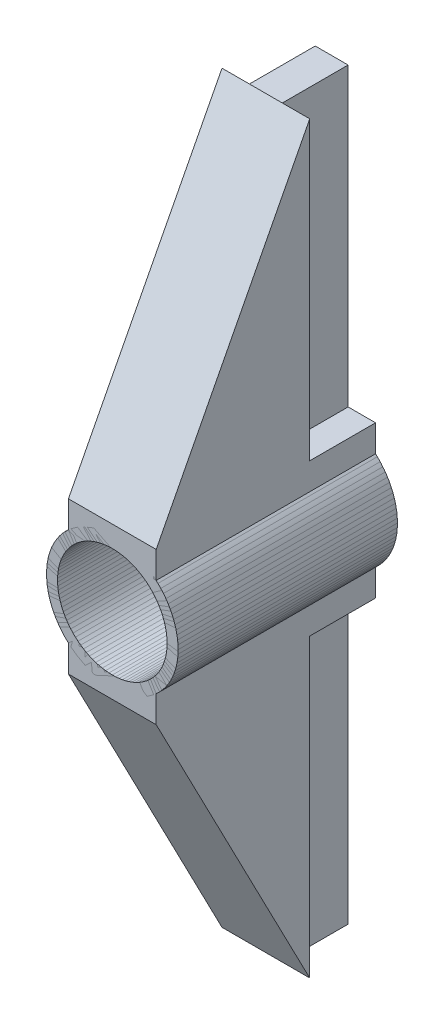
ISO-10303-21;
HEADER;
FILE_DESCRIPTION(('STEP AP214'),'2;1');
FILE_NAME('part.step','',(''),(''),'','','');
FILE_SCHEMA(('AUTOMOTIVE_DESIGN { 1 0 10303 214 1 1 1 1 }'));
ENDSEC;
DATA;
#1=APPLICATION_CONTEXT('core data for automotive mechanical design processes');
#2=APPLICATION_PROTOCOL_DEFINITION('international standard','automotive_design',2000,#1);
#3=PRODUCT_CONTEXT('',#1,'mechanical');
#4=PRODUCT('Part','Part','',(#3));
#5=PRODUCT_RELATED_PRODUCT_CATEGORY('part','',(#4));
#6=PRODUCT_DEFINITION_FORMATION('','',#4);
#7=PRODUCT_DEFINITION_CONTEXT('part definition',#1,'design');
#8=PRODUCT_DEFINITION('design','',#6,#7);
#9=PRODUCT_DEFINITION_SHAPE('','',#8);
#10=(LENGTH_UNIT() NAMED_UNIT(*) SI_UNIT(.MILLI.,.METRE.));
#11=(NAMED_UNIT(*) PLANE_ANGLE_UNIT() SI_UNIT($,.RADIAN.));
#12=(NAMED_UNIT(*) SI_UNIT($,.STERADIAN.) SOLID_ANGLE_UNIT());
#13=UNCERTAINTY_MEASURE_WITH_UNIT(LENGTH_MEASURE(1.E-05),#10,'distance_accuracy_value','');
#14=(GEOMETRIC_REPRESENTATION_CONTEXT(3) GLOBAL_UNCERTAINTY_ASSIGNED_CONTEXT((#13)) GLOBAL_UNIT_ASSIGNED_CONTEXT((#10,
#11,#12)) REPRESENTATION_CONTEXT('',''));
#15=CARTESIAN_POINT('',(0.,0.,0.));
#16=DIRECTION('',(0.,0.,1.));
#17=DIRECTION('',(1.,0.,0.));
#18=AXIS2_PLACEMENT_3D('',#15,#16,#17);
#19=CARTESIAN_POINT('',(0.,0.,20.));
#20=DIRECTION('',(0.,0.,-1.));
#21=DIRECTION('',(1.,0.,0.));
#22=AXIS2_PLACEMENT_3D('',#19,#20,#21);
#23=CYLINDRICAL_SURFACE('',#22,6.);
#24=DIRECTION('',(0.,0.,-1.));
#25=VECTOR('',#24,1.);
#26=CARTESIAN_POINT('',(-3.99999999999997,-4.47213595499961,20.));
#27=LINE('',#26,#25);
#28=CARTESIAN_POINT('',(-3.99999999999997,-4.47213595499961,20.));
#29=VERTEX_POINT('',#28);
#30=CARTESIAN_POINT('',(-3.99999999999997,-4.47213595499961,0.));
#31=VERTEX_POINT('',#30);
#32=EDGE_CURVE('E12',#29,#31,#27,.T.);
#33=ORIENTED_EDGE('',*,*,#32,.F.);
#34=CARTESIAN_POINT('',(0.,0.,20.));
#35=DIRECTION('',(0.,0.,1.));
#36=DIRECTION('',(-1.,0.,0.));
#37=AXIS2_PLACEMENT_3D('',#34,#35,#36);
#38=CIRCLE('',#37,6.);
#39=CARTESIAN_POINT('',(4.00000000000003,-4.47213595499955,20.));
#40=VERTEX_POINT('',#39);
#41=EDGE_CURVE('E235',#40,#29,#38,.T.);
#42=ORIENTED_EDGE('',*,*,#41,.F.);
#43=DIRECTION('',(0.,0.,-1.));
#44=VECTOR('',#43,1.);
#45=CARTESIAN_POINT('',(4.00000000000003,-4.47213595499955,20.));
#46=LINE('',#45,#44);
#47=CARTESIAN_POINT('',(4.00000000000003,-4.47213595499955,0.));
#48=VERTEX_POINT('',#47);
#49=EDGE_CURVE('E63',#40,#48,#46,.T.);
#50=ORIENTED_EDGE('',*,*,#49,.T.);
#51=CARTESIAN_POINT('',(0.,0.,0.));
#52=DIRECTION('',(0.,0.,1.));
#53=DIRECTION('',(-1.,0.,0.));
#54=AXIS2_PLACEMENT_3D('',#51,#52,#53);
#55=CIRCLE('',#54,6.);
#56=EDGE_CURVE('E231',#48,#31,#55,.T.);
#57=ORIENTED_EDGE('',*,*,#56,.T.);
#58=EDGE_LOOP('',(#33,#42,#50,#57));
#59=FACE_BOUND('',#58,.T.);
#60=ADVANCED_FACE('F55',(#59),#23,.T.);
#61=CARTESIAN_POINT('',(0.,0.,20.));
#62=DIRECTION('',(0.,0.,-1.));
#63=DIRECTION('',(1.,0.,0.));
#64=AXIS2_PLACEMENT_3D('',#61,#62,#63);
#65=CYLINDRICAL_SURFACE('',#64,5.);
#66=CARTESIAN_POINT('',(0.,0.,0.));
#67=DIRECTION('',(0.,0.,1.));
#68=DIRECTION('',(-1.,0.,0.));
#69=AXIS2_PLACEMENT_3D('',#66,#67,#68);
#70=CIRCLE('',#69,5.);
#71=CARTESIAN_POINT('',(-5.,0.,0.));
#72=VERTEX_POINT('',#71);
#73=EDGE_CURVE('E226',#72,#72,#70,.T.);
#74=ORIENTED_EDGE('',*,*,#73,.F.);
#75=EDGE_LOOP('',(#74));
#76=FACE_BOUND('',#75,.T.);
#77=CARTESIAN_POINT('',(0.,0.,20.));
#78=DIRECTION('',(0.,0.,1.));
#79=DIRECTION('',(-1.,0.,0.));
#80=AXIS2_PLACEMENT_3D('',#77,#78,#79);
#81=CIRCLE('',#80,5.);
#82=CARTESIAN_POINT('',(-5.,0.,20.));
#83=VERTEX_POINT('',#82);
#84=EDGE_CURVE('E227',#83,#83,#81,.T.);
#85=ORIENTED_EDGE('',*,*,#84,.T.);
#86=EDGE_LOOP('',(#85));
#87=FACE_BOUND('',#86,.T.);
#88=ADVANCED_FACE('F289',(#76,#87),#65,.F.);
#89=CARTESIAN_POINT('',(0.,0.,20.));
#90=DIRECTION('',(0.,0.,1.));
#91=DIRECTION('',(-1.,0.,0.));
#92=AXIS2_PLACEMENT_3D('',#89,#90,#91);
#93=PLANE('',#92);
#94=ORIENTED_EDGE('',*,*,#84,.F.);
#95=EDGE_LOOP('',(#94));
#96=FACE_BOUND('',#95,.T.);
#97=ORIENTED_EDGE('',*,*,#41,.T.);
#98=DIRECTION('',(0.,1.,0.));
#99=VECTOR('',#98,1.);
#100=CARTESIAN_POINT('',(-3.99999999999995,-6.91977190049356,20.));
#101=LINE('',#100,#99);
#102=CARTESIAN_POINT('',(-3.99999999999995,-6.91977190049356,20.));
#103=VERTEX_POINT('',#102);
#104=EDGE_CURVE('E198',#103,#29,#101,.T.);
#105=ORIENTED_EDGE('',*,*,#104,.F.);
#106=DIRECTION('',(1.,0.,0.));
#107=VECTOR('',#106,1.);
#108=CARTESIAN_POINT('',(-3.99999999999995,-6.91977190049356,20.));
#109=LINE('',#108,#107);
#110=CARTESIAN_POINT('',(4.00000000000005,-6.9197719004935,20.));
#111=VERTEX_POINT('',#110);
#112=EDGE_CURVE('E222',#103,#111,#109,.T.);
#113=ORIENTED_EDGE('',*,*,#112,.T.);
#114=DIRECTION('',(0.,1.,0.));
#115=VECTOR('',#114,1.);
#116=CARTESIAN_POINT('',(4.00000000000005,-6.9197719004935,20.));
#117=LINE('',#116,#115);
#118=EDGE_CURVE('E208',#111,#40,#117,.T.);
#119=ORIENTED_EDGE('',*,*,#118,.T.);
#120=EDGE_LOOP('',(#97,#105,#113,#119));
#121=FACE_BOUND('',#120,.T.);
#122=ADVANCED_FACE('F254',(#96,#121),#93,.T.);
#123=CARTESIAN_POINT('',(0.,0.,0.));
#124=DIRECTION('',(0.,0.,1.));
#125=DIRECTION('',(-1.,0.,0.));
#126=AXIS2_PLACEMENT_3D('',#123,#124,#125);
#127=PLANE('',#126);
#128=ORIENTED_EDGE('',*,*,#73,.T.);
#129=EDGE_LOOP('',(#128));
#130=FACE_BOUND('',#129,.T.);
#131=DIRECTION('',(1.,0.,0.));
#132=VECTOR('',#131,1.);
#133=CARTESIAN_POINT('',(4.00000000000005,-6.9197719004935,0.));
#134=LINE('',#133,#132);
#135=CARTESIAN_POINT('',(1.50000000000005,-6.91977190049352,0.));
#136=VERTEX_POINT('',#135);
#137=CARTESIAN_POINT('',(4.00000000000005,-6.9197719004935,0.));
#138=VERTEX_POINT('',#137);
#139=EDGE_CURVE('E149',#136,#138,#134,.T.);
#140=ORIENTED_EDGE('',*,*,#139,.F.);
#141=DIRECTION('',(0.,-1.,0.));
#142=VECTOR('',#141,1.);
#143=CARTESIAN_POINT('',(1.50000000000005,-6.91977190049352,0.));
#144=LINE('',#143,#142);
#145=CARTESIAN_POINT('',(1.50000000000024,-33.9197719004935,0.));
#146=VERTEX_POINT('',#145);
#147=EDGE_CURVE('E161',#136,#146,#144,.T.);
#148=ORIENTED_EDGE('',*,*,#147,.T.);
#149=DIRECTION('',(1.,0.,0.));
#150=VECTOR('',#149,1.);
#151=CARTESIAN_POINT('',(-3.99999999999976,-33.9197719004936,0.));
#152=LINE('',#151,#150);
#153=CARTESIAN_POINT('',(-1.49999999999976,-33.9197719004935,0.));
#154=VERTEX_POINT('',#153);
#155=EDGE_CURVE('E218',#154,#146,#152,.T.);
#156=ORIENTED_EDGE('',*,*,#155,.F.);
#157=DIRECTION('',(0.,-1.,0.));
#158=VECTOR('',#157,1.);
#159=CARTESIAN_POINT('',(-1.49999999999995,-6.91977190049354,0.));
#160=LINE('',#159,#158);
#161=CARTESIAN_POINT('',(-1.49999999999995,-6.91977190049354,0.));
#162=VERTEX_POINT('',#161);
#163=EDGE_CURVE('E70',#162,#154,#160,.T.);
#164=ORIENTED_EDGE('',*,*,#163,.F.);
#165=DIRECTION('',(1.,0.,0.));
#166=VECTOR('',#165,1.);
#167=CARTESIAN_POINT('',(-3.99999999999995,-6.91977190049356,0.));
#168=LINE('',#167,#166);
#169=CARTESIAN_POINT('',(-3.99999999999995,-6.91977190049356,0.));
#170=VERTEX_POINT('',#169);
#171=EDGE_CURVE('E188',#170,#162,#168,.T.);
#172=ORIENTED_EDGE('',*,*,#171,.F.);
#173=DIRECTION('',(0.,-1.,0.));
#174=VECTOR('',#173,1.);
#175=CARTESIAN_POINT('',(-3.99999999999997,-3.91977190049356,0.));
#176=LINE('',#175,#174);
#177=EDGE_CURVE('E201',#31,#170,#176,.T.);
#178=ORIENTED_EDGE('',*,*,#177,.F.);
#179=ORIENTED_EDGE('',*,*,#56,.F.);
#180=DIRECTION('',(0.,-1.,0.));
#181=VECTOR('',#180,1.);
#182=CARTESIAN_POINT('',(4.00000000000003,-3.9197719004935,0.));
#183=LINE('',#182,#181);
#184=EDGE_CURVE('E78',#48,#138,#183,.T.);
#185=ORIENTED_EDGE('',*,*,#184,.T.);
#186=EDGE_LOOP('',(#140,#148,#156,#164,#172,#178,#179,#185));
#187=FACE_BOUND('',#186,.T.);
#188=ADVANCED_FACE('F248',(#130,#187),#127,.F.);
#189=CARTESIAN_POINT('',(-4.,0.,0.));
#190=DIRECTION('',(1.,0.,0.));
#191=DIRECTION('',(0.,0.,1.));
#192=AXIS2_PLACEMENT_3D('',#189,#190,#191);
#193=PLANE('',#192);
#194=DIRECTION('',(0.,0.,-1.));
#195=VECTOR('',#194,1.);
#196=CARTESIAN_POINT('',(-3.99999999999995,-6.91977190049356,6.));
#197=LINE('',#196,#195);
#198=CARTESIAN_POINT('',(-3.99999999999995,-6.91977190049356,6.));
#199=VERTEX_POINT('',#198);
#200=EDGE_CURVE('E180',#199,#170,#197,.T.);
#201=ORIENTED_EDGE('',*,*,#200,.F.);
#202=DIRECTION('',(0.,-1.,0.));
#203=VECTOR('',#202,1.);
#204=CARTESIAN_POINT('',(-3.99999999999995,-6.91977190049356,6.));
#205=LINE('',#204,#203);
#206=CARTESIAN_POINT('',(-3.99999999999976,-33.9197719004936,6.));
#207=VERTEX_POINT('',#206);
#208=EDGE_CURVE('E172',#199,#207,#205,.T.);
#209=ORIENTED_EDGE('',*,*,#208,.T.);
#210=DIRECTION('',(0.,0.887754531448929,0.460317164455));
#211=VECTOR('',#210,1.);
#212=CARTESIAN_POINT('',(-3.99999999999995,-6.91977190049356,20.));
#213=LINE('',#212,#211);
#214=EDGE_CURVE('E194',#207,#103,#213,.T.);
#215=ORIENTED_EDGE('',*,*,#214,.T.);
#216=ORIENTED_EDGE('',*,*,#104,.T.);
#217=ORIENTED_EDGE('',*,*,#32,.T.);
#218=ORIENTED_EDGE('',*,*,#177,.T.);
#219=EDGE_LOOP('',(#201,#209,#215,#216,#217,#218));
#220=FACE_BOUND('',#219,.T.);
#221=ADVANCED_FACE('F252',(#220),#193,.F.);
#222=CARTESIAN_POINT('',(4.,0.,0.));
#223=DIRECTION('',(1.,0.,0.));
#224=DIRECTION('',(0.,0.,1.));
#225=AXIS2_PLACEMENT_3D('',#222,#223,#224);
#226=PLANE('',#225);
#227=DIRECTION('',(0.,-1.,0.));
#228=VECTOR('',#227,1.);
#229=CARTESIAN_POINT('',(4.00000000000005,-6.9197719004935,6.));
#230=LINE('',#229,#228);
#231=CARTESIAN_POINT('',(4.00000000000005,-6.9197719004935,6.));
#232=VERTEX_POINT('',#231);
#233=CARTESIAN_POINT('',(4.00000000000024,-33.9197719004935,6.));
#234=VERTEX_POINT('',#233);
#235=EDGE_CURVE('E137',#232,#234,#230,.T.);
#236=ORIENTED_EDGE('',*,*,#235,.F.);
#237=DIRECTION('',(0.,0.,1.));
#238=VECTOR('',#237,1.);
#239=CARTESIAN_POINT('',(4.00000000000005,-6.9197719004935,6.));
#240=LINE('',#239,#238);
#241=EDGE_CURVE('E145',#138,#232,#240,.T.);
#242=ORIENTED_EDGE('',*,*,#241,.F.);
#243=ORIENTED_EDGE('',*,*,#184,.F.);
#244=ORIENTED_EDGE('',*,*,#49,.F.);
#245=ORIENTED_EDGE('',*,*,#118,.F.);
#246=DIRECTION('',(0.,0.887754531448929,0.460317164455));
#247=VECTOR('',#246,1.);
#248=CARTESIAN_POINT('',(4.00000000000005,-6.9197719004935,20.));
#249=LINE('',#248,#247);
#250=EDGE_CURVE('E156',#234,#111,#249,.T.);
#251=ORIENTED_EDGE('',*,*,#250,.F.);
#252=EDGE_LOOP('',(#236,#242,#243,#244,#245,#251));
#253=FACE_BOUND('',#252,.T.);
#254=ADVANCED_FACE('F154',(#253),#226,.T.);
#255=CARTESIAN_POINT('',(-3.99999999999995,-6.91977190049356,20.));
#256=DIRECTION('',(0.,0.460317164455,-0.887754531448929));
#257=DIRECTION('',(0.,-0.887754531448929,-0.460317164455));
#258=AXIS2_PLACEMENT_3D('',#255,#256,#257);
#259=PLANE('',#258);
#260=ORIENTED_EDGE('',*,*,#250,.T.);
#261=ORIENTED_EDGE('',*,*,#112,.F.);
#262=ORIENTED_EDGE('',*,*,#214,.F.);
#263=DIRECTION('',(1.,0.,0.));
#264=VECTOR('',#263,1.);
#265=CARTESIAN_POINT('',(-3.99999999999976,-33.9197719004936,6.));
#266=LINE('',#265,#264);
#267=CARTESIAN_POINT('',(-1.49999999999976,-33.9197719004935,6.));
#268=VERTEX_POINT('',#267);
#269=EDGE_CURVE('E214',#207,#268,#266,.T.);
#270=ORIENTED_EDGE('',*,*,#269,.T.);
#271=CARTESIAN_POINT('',(1.50000000000024,-33.9197719004935,6.));
#272=VERTEX_POINT('',#271);
#273=EDGE_CURVE('E205',#268,#272,#266,.T.);
#274=ORIENTED_EDGE('',*,*,#273,.T.);
#275=DIRECTION('',(-1.,0.,0.));
#276=VECTOR('',#275,1.);
#277=CARTESIAN_POINT('',(1.50000000000024,-33.9197719004935,6.));
#278=LINE('',#277,#276);
#279=EDGE_CURVE('E179',#234,#272,#278,.T.);
#280=ORIENTED_EDGE('',*,*,#279,.F.);
#281=EDGE_LOOP('',(#260,#261,#262,#270,#274,#280));
#282=FACE_BOUND('',#281,.T.);
#283=ADVANCED_FACE('F258',(#282),#259,.F.);
#284=CARTESIAN_POINT('',(-3.99999999999976,-33.9197719004936,6.));
#285=DIRECTION('',(0.,1.,0.));
#286=DIRECTION('',(0.,0.,-1.));
#287=AXIS2_PLACEMENT_3D('',#284,#285,#286);
#288=PLANE('',#287);
#289=ORIENTED_EDGE('',*,*,#155,.T.);
#290=DIRECTION('',(0.,0.,-1.));
#291=VECTOR('',#290,1.);
#292=CARTESIAN_POINT('',(1.50000000000024,-33.9197719004935,0.));
#293=LINE('',#292,#291);
#294=EDGE_CURVE('E151',#272,#146,#293,.T.);
#295=ORIENTED_EDGE('',*,*,#294,.F.);
#296=ORIENTED_EDGE('',*,*,#273,.F.);
#297=DIRECTION('',(0.,0.,1.));
#298=VECTOR('',#297,1.);
#299=CARTESIAN_POINT('',(-1.49999999999976,-33.9197719004935,0.));
#300=LINE('',#299,#298);
#301=EDGE_CURVE('E176',#154,#268,#300,.T.);
#302=ORIENTED_EDGE('',*,*,#301,.F.);
#303=EDGE_LOOP('',(#289,#295,#296,#302));
#304=FACE_BOUND('',#303,.T.);
#305=ADVANCED_FACE('F272',(#304),#288,.F.);
#306=CARTESIAN_POINT('',(-1.49999999999995,-6.91977190049354,6.));
#307=DIRECTION('',(0.,0.,1.));
#308=DIRECTION('',(-1.,0.,0.));
#309=AXIS2_PLACEMENT_3D('',#306,#307,#308);
#310=PLANE('',#309);
#311=ORIENTED_EDGE('',*,*,#269,.F.);
#312=ORIENTED_EDGE('',*,*,#208,.F.);
#313=DIRECTION('',(-1.,0.,0.));
#314=VECTOR('',#313,1.);
#315=CARTESIAN_POINT('',(-1.49999999999995,-6.91977190049354,6.));
#316=LINE('',#315,#314);
#317=CARTESIAN_POINT('',(-1.49999999999995,-6.91977190049354,6.));
#318=VERTEX_POINT('',#317);
#319=EDGE_CURVE('E168',#318,#199,#316,.T.);
#320=ORIENTED_EDGE('',*,*,#319,.F.);
#321=DIRECTION('',(0.,-1.,0.));
#322=VECTOR('',#321,1.);
#323=CARTESIAN_POINT('',(-1.49999999999995,-6.91977190049354,6.));
#324=LINE('',#323,#322);
#325=EDGE_CURVE('E169',#318,#268,#324,.T.);
#326=ORIENTED_EDGE('',*,*,#325,.T.);
#327=EDGE_LOOP('',(#311,#312,#320,#326));
#328=FACE_BOUND('',#327,.T.);
#329=ADVANCED_FACE('F278',(#328),#310,.F.);
#330=CARTESIAN_POINT('',(-1.49999999999995,-6.91977190049354,0.));
#331=DIRECTION('',(1.,0.,0.));
#332=DIRECTION('',(0.,0.,1.));
#333=AXIS2_PLACEMENT_3D('',#330,#331,#332);
#334=PLANE('',#333);
#335=ORIENTED_EDGE('',*,*,#301,.T.);
#336=ORIENTED_EDGE('',*,*,#325,.F.);
#337=DIRECTION('',(0.,0.,1.));
#338=VECTOR('',#337,1.);
#339=CARTESIAN_POINT('',(-1.49999999999995,-6.91977190049354,0.));
#340=LINE('',#339,#338);
#341=EDGE_CURVE('E184',#162,#318,#340,.T.);
#342=ORIENTED_EDGE('',*,*,#341,.F.);
#343=ORIENTED_EDGE('',*,*,#163,.T.);
#344=EDGE_LOOP('',(#335,#336,#342,#343));
#345=FACE_BOUND('',#344,.T.);
#346=ADVANCED_FACE('F273',(#345),#334,.F.);
#347=CARTESIAN_POINT('',(0.,-6.91977190049353,0.));
#348=DIRECTION('',(0.,-1.,0.));
#349=DIRECTION('',(0.,0.,1.));
#350=AXIS2_PLACEMENT_3D('',#347,#348,#349);
#351=PLANE('',#350);
#352=ORIENTED_EDGE('',*,*,#200,.T.);
#353=ORIENTED_EDGE('',*,*,#171,.T.);
#354=ORIENTED_EDGE('',*,*,#341,.T.);
#355=ORIENTED_EDGE('',*,*,#319,.T.);
#356=EDGE_LOOP('',(#352,#353,#354,#355));
#357=FACE_BOUND('',#356,.T.);
#358=ADVANCED_FACE('F277',(#357),#351,.T.);
#359=CARTESIAN_POINT('',(1.50000000000005,-6.91977190049352,0.));
#360=DIRECTION('',(-1.,0.,0.));
#361=DIRECTION('',(0.,0.,-1.));
#362=AXIS2_PLACEMENT_3D('',#359,#360,#361);
#363=PLANE('',#362);
#364=ORIENTED_EDGE('',*,*,#294,.T.);
#365=ORIENTED_EDGE('',*,*,#147,.F.);
#366=DIRECTION('',(0.,0.,-1.));
#367=VECTOR('',#366,1.);
#368=CARTESIAN_POINT('',(1.50000000000005,-6.91977190049352,0.));
#369=LINE('',#368,#367);
#370=CARTESIAN_POINT('',(1.50000000000005,-6.91977190049352,6.));
#371=VERTEX_POINT('',#370);
#372=EDGE_CURVE('E144',#371,#136,#369,.T.);
#373=ORIENTED_EDGE('',*,*,#372,.F.);
#374=DIRECTION('',(0.,-1.,0.));
#375=VECTOR('',#374,1.);
#376=CARTESIAN_POINT('',(1.50000000000005,-6.91977190049352,6.));
#377=LINE('',#376,#375);
#378=EDGE_CURVE('E139',#371,#272,#377,.T.);
#379=ORIENTED_EDGE('',*,*,#378,.T.);
#380=EDGE_LOOP('',(#364,#365,#373,#379));
#381=FACE_BOUND('',#380,.T.);
#382=ADVANCED_FACE('F315',(#381),#363,.F.);
#383=CARTESIAN_POINT('',(1.50000000000005,-6.91977190049352,6.));
#384=DIRECTION('',(0.,0.,1.));
#385=DIRECTION('',(-1.,0.,0.));
#386=AXIS2_PLACEMENT_3D('',#383,#384,#385);
#387=PLANE('',#386);
#388=ORIENTED_EDGE('',*,*,#279,.T.);
#389=ORIENTED_EDGE('',*,*,#378,.F.);
#390=DIRECTION('',(-1.,0.,0.));
#391=VECTOR('',#390,1.);
#392=CARTESIAN_POINT('',(1.50000000000005,-6.91977190049352,6.));
#393=LINE('',#392,#391);
#394=EDGE_CURVE('E132',#232,#371,#393,.T.);
#395=ORIENTED_EDGE('',*,*,#394,.F.);
#396=ORIENTED_EDGE('',*,*,#235,.T.);
#397=EDGE_LOOP('',(#388,#389,#395,#396));
#398=FACE_BOUND('',#397,.T.);
#399=ADVANCED_FACE('F135',(#398),#387,.F.);
#400=CARTESIAN_POINT('',(0.,-6.91977190049353,0.));
#401=DIRECTION('',(0.,1.,0.));
#402=DIRECTION('',(0.,0.,-1.));
#403=AXIS2_PLACEMENT_3D('',#400,#401,#402);
#404=PLANE('',#403);
#405=ORIENTED_EDGE('',*,*,#241,.T.);
#406=ORIENTED_EDGE('',*,*,#394,.T.);
#407=ORIENTED_EDGE('',*,*,#372,.T.);
#408=ORIENTED_EDGE('',*,*,#139,.T.);
#409=EDGE_LOOP('',(#405,#406,#407,#408));
#410=FACE_BOUND('',#409,.T.);
#411=ADVANCED_FACE('F147',(#410),#404,.F.);
#412=CLOSED_SHELL('',(#60,#88,#122,#188,#221,#254,#283,#305,#329,#346,#358,#382,#399,#411));
#413=MANIFOLD_SOLID_BREP('B2',#412);
#414=CARTESIAN_POINT('',(0.,0.,20.));
#415=DIRECTION('',(0.,0.,-1.));
#416=DIRECTION('',(-1.,0.,0.));
#417=AXIS2_PLACEMENT_3D('',#414,#415,#416);
#418=CYLINDRICAL_SURFACE('',#417,6.);
#419=DIRECTION('',(0.,0.,-1.));
#420=VECTOR('',#419,1.);
#421=CARTESIAN_POINT('',(4.,4.47213595499958,20.));
#422=LINE('',#421,#420);
#423=CARTESIAN_POINT('',(4.,4.47213595499958,20.));
#424=VERTEX_POINT('',#423);
#425=CARTESIAN_POINT('',(4.,4.47213595499958,0.));
#426=VERTEX_POINT('',#425);
#427=EDGE_CURVE('E53',#424,#426,#422,.T.);
#428=ORIENTED_EDGE('',*,*,#427,.F.);
#429=CARTESIAN_POINT('',(0.,0.,20.));
#430=DIRECTION('',(0.,0.,1.));
#431=DIRECTION('',(1.,0.,0.));
#432=AXIS2_PLACEMENT_3D('',#429,#430,#431);
#433=CIRCLE('',#432,6.);
#434=CARTESIAN_POINT('',(-4.,4.47213595499958,20.));
#435=VERTEX_POINT('',#434);
#436=EDGE_CURVE('E566',#435,#424,#433,.T.);
#437=ORIENTED_EDGE('',*,*,#436,.F.);
#438=DIRECTION('',(0.,0.,-1.));
#439=VECTOR('',#438,1.);
#440=CARTESIAN_POINT('',(-4.,4.47213595499958,20.));
#441=LINE('',#440,#439);
#442=CARTESIAN_POINT('',(-4.,4.47213595499958,0.));
#443=VERTEX_POINT('',#442);
#444=EDGE_CURVE('E418',#435,#443,#441,.T.);
#445=ORIENTED_EDGE('',*,*,#444,.T.);
#446=CARTESIAN_POINT('',(0.,0.,0.));
#447=DIRECTION('',(0.,0.,1.));
#448=DIRECTION('',(1.,0.,0.));
#449=AXIS2_PLACEMENT_3D('',#446,#447,#448);
#450=CIRCLE('',#449,6.);
#451=EDGE_CURVE('E563',#443,#426,#450,.T.);
#452=ORIENTED_EDGE('',*,*,#451,.T.);
#453=EDGE_LOOP('',(#428,#437,#445,#452));
#454=FACE_BOUND('',#453,.T.);
#455=ADVANCED_FACE('F411',(#454),#418,.T.);
#456=CARTESIAN_POINT('',(0.,0.,20.));
#457=DIRECTION('',(0.,0.,-1.));
#458=DIRECTION('',(-1.,0.,0.));
#459=AXIS2_PLACEMENT_3D('',#456,#457,#458);
#460=CYLINDRICAL_SURFACE('',#459,5.);
#461=CARTESIAN_POINT('',(0.,0.,0.));
#462=DIRECTION('',(0.,0.,1.));
#463=DIRECTION('',(1.,0.,0.));
#464=AXIS2_PLACEMENT_3D('',#461,#462,#463);
#465=CIRCLE('',#464,5.);
#466=CARTESIAN_POINT('',(5.,0.,0.));
#467=VERTEX_POINT('',#466);
#468=EDGE_CURVE('E559',#467,#467,#465,.T.);
#469=ORIENTED_EDGE('',*,*,#468,.F.);
#470=EDGE_LOOP('',(#469));
#471=FACE_BOUND('',#470,.T.);
#472=CARTESIAN_POINT('',(0.,0.,20.));
#473=DIRECTION('',(0.,0.,1.));
#474=DIRECTION('',(1.,0.,0.));
#475=AXIS2_PLACEMENT_3D('',#472,#473,#474);
#476=CIRCLE('',#475,5.);
#477=CARTESIAN_POINT('',(5.,0.,20.));
#478=VERTEX_POINT('',#477);
#479=EDGE_CURVE('E560',#478,#478,#476,.T.);
#480=ORIENTED_EDGE('',*,*,#479,.T.);
#481=EDGE_LOOP('',(#480));
#482=FACE_BOUND('',#481,.T.);
#483=ADVANCED_FACE('F614',(#471,#482),#460,.F.);
#484=CARTESIAN_POINT('',(0.,0.,20.));
#485=DIRECTION('',(0.,0.,1.));
#486=DIRECTION('',(1.,0.,0.));
#487=AXIS2_PLACEMENT_3D('',#484,#485,#486);
#488=PLANE('',#487);
#489=ORIENTED_EDGE('',*,*,#479,.F.);
#490=EDGE_LOOP('',(#489));
#491=FACE_BOUND('',#490,.T.);
#492=ORIENTED_EDGE('',*,*,#436,.T.);
#493=DIRECTION('',(0.,-1.,0.));
#494=VECTOR('',#493,1.);
#495=CARTESIAN_POINT('',(4.,6.91977190049353,20.));
#496=LINE('',#495,#494);
#497=CARTESIAN_POINT('',(4.,6.91977190049353,20.));
#498=VERTEX_POINT('',#497);
#499=EDGE_CURVE('E539',#498,#424,#496,.T.);
#500=ORIENTED_EDGE('',*,*,#499,.F.);
#501=DIRECTION('',(-1.,0.,0.));
#502=VECTOR('',#501,1.);
#503=CARTESIAN_POINT('',(4.,6.91977190049353,20.));
#504=LINE('',#503,#502);
#505=CARTESIAN_POINT('',(-4.,6.91977190049353,20.));
#506=VERTEX_POINT('',#505);
#507=EDGE_CURVE('E556',#498,#506,#504,.T.);
#508=ORIENTED_EDGE('',*,*,#507,.T.);
#509=DIRECTION('',(0.,-1.,0.));
#510=VECTOR('',#509,1.);
#511=CARTESIAN_POINT('',(-4.,6.91977190049353,20.));
#512=LINE('',#511,#510);
#513=EDGE_CURVE('E546',#506,#435,#512,.T.);
#514=ORIENTED_EDGE('',*,*,#513,.T.);
#515=EDGE_LOOP('',(#492,#500,#508,#514));
#516=FACE_BOUND('',#515,.T.);
#517=ADVANCED_FACE('F582',(#491,#516),#488,.T.);
#518=CARTESIAN_POINT('',(0.,0.,0.));
#519=DIRECTION('',(0.,0.,1.));
#520=DIRECTION('',(1.,0.,0.));
#521=AXIS2_PLACEMENT_3D('',#518,#519,#520);
#522=PLANE('',#521);
#523=ORIENTED_EDGE('',*,*,#468,.T.);
#524=EDGE_LOOP('',(#523));
#525=FACE_BOUND('',#524,.T.);
#526=DIRECTION('',(-1.,0.,0.));
#527=VECTOR('',#526,1.);
#528=CARTESIAN_POINT('',(-4.,6.91977190049353,0.));
#529=LINE('',#528,#527);
#530=CARTESIAN_POINT('',(-1.5,6.91977190049353,0.));
#531=VERTEX_POINT('',#530);
#532=CARTESIAN_POINT('',(-4.,6.91977190049353,0.));
#533=VERTEX_POINT('',#532);
#534=EDGE_CURVE('E503',#531,#533,#529,.T.);
#535=ORIENTED_EDGE('',*,*,#534,.F.);
#536=DIRECTION('',(0.,1.,0.));
#537=VECTOR('',#536,1.);
#538=CARTESIAN_POINT('',(-1.5,6.91977190049353,0.));
#539=LINE('',#538,#537);
#540=CARTESIAN_POINT('',(-1.5,33.9197719004935,0.));
#541=VERTEX_POINT('',#540);
#542=EDGE_CURVE('E511',#531,#541,#539,.T.);
#543=ORIENTED_EDGE('',*,*,#542,.T.);
#544=DIRECTION('',(-1.,0.,0.));
#545=VECTOR('',#544,1.);
#546=CARTESIAN_POINT('',(4.,33.9197719004935,0.));
#547=LINE('',#546,#545);
#548=CARTESIAN_POINT('',(1.5,33.9197719004935,0.));
#549=VERTEX_POINT('',#548);
#550=EDGE_CURVE('E553',#549,#541,#547,.T.);
#551=ORIENTED_EDGE('',*,*,#550,.F.);
#552=DIRECTION('',(0.,1.,0.));
#553=VECTOR('',#552,1.);
#554=CARTESIAN_POINT('',(1.5,6.91977190049353,0.));
#555=LINE('',#554,#553);
#556=CARTESIAN_POINT('',(1.5,6.91977190049353,0.));
#557=VERTEX_POINT('',#556);
#558=EDGE_CURVE('E425',#557,#549,#555,.T.);
#559=ORIENTED_EDGE('',*,*,#558,.F.);
#560=DIRECTION('',(-1.,0.,0.));
#561=VECTOR('',#560,1.);
#562=CARTESIAN_POINT('',(4.,6.91977190049353,0.));
#563=LINE('',#562,#561);
#564=CARTESIAN_POINT('',(4.,6.91977190049353,0.));
#565=VERTEX_POINT('',#564);
#566=EDGE_CURVE('E532',#565,#557,#563,.T.);
#567=ORIENTED_EDGE('',*,*,#566,.F.);
#568=DIRECTION('',(0.,1.,0.));
#569=VECTOR('',#568,1.);
#570=CARTESIAN_POINT('',(4.,3.91977190049353,0.));
#571=LINE('',#570,#569);
#572=EDGE_CURVE('E541',#426,#565,#571,.T.);
#573=ORIENTED_EDGE('',*,*,#572,.F.);
#574=ORIENTED_EDGE('',*,*,#451,.F.);
#575=DIRECTION('',(0.,1.,0.));
#576=VECTOR('',#575,1.);
#577=CARTESIAN_POINT('',(-4.,3.91977190049353,0.));
#578=LINE('',#577,#576);
#579=EDGE_CURVE('E433',#443,#533,#578,.T.);
#580=ORIENTED_EDGE('',*,*,#579,.T.);
#581=EDGE_LOOP('',(#535,#543,#551,#559,#567,#573,#574,#580));
#582=FACE_BOUND('',#581,.T.);
#583=ADVANCED_FACE('F576',(#525,#582),#522,.F.);
#584=CARTESIAN_POINT('',(4.,0.,0.));
#585=DIRECTION('',(-1.,0.,0.));
#586=DIRECTION('',(0.,0.,1.));
#587=AXIS2_PLACEMENT_3D('',#584,#585,#586);
#588=PLANE('',#587);
#589=DIRECTION('',(0.,0.,-1.));
#590=VECTOR('',#589,1.);
#591=CARTESIAN_POINT('',(4.,6.91977190049353,6.));
#592=LINE('',#591,#590);
#593=CARTESIAN_POINT('',(4.,6.91977190049353,6.));
#594=VERTEX_POINT('',#593);
#595=EDGE_CURVE('E526',#594,#565,#592,.T.);
#596=ORIENTED_EDGE('',*,*,#595,.F.);
#597=DIRECTION('',(0.,1.,0.));
#598=VECTOR('',#597,1.);
#599=CARTESIAN_POINT('',(4.,6.91977190049353,6.));
#600=LINE('',#599,#598);
#601=CARTESIAN_POINT('',(4.,33.9197719004935,6.));
#602=VERTEX_POINT('',#601);
#603=EDGE_CURVE('E520',#594,#602,#600,.T.);
#604=ORIENTED_EDGE('',*,*,#603,.T.);
#605=DIRECTION('',(0.,-0.887754531448929,0.460317164455));
#606=VECTOR('',#605,1.);
#607=CARTESIAN_POINT('',(4.,6.91977190049353,20.));
#608=LINE('',#607,#606);
#609=EDGE_CURVE('E536',#602,#498,#608,.T.);
#610=ORIENTED_EDGE('',*,*,#609,.T.);
#611=ORIENTED_EDGE('',*,*,#499,.T.);
#612=ORIENTED_EDGE('',*,*,#427,.T.);
#613=ORIENTED_EDGE('',*,*,#572,.T.);
#614=EDGE_LOOP('',(#596,#604,#610,#611,#612,#613));
#615=FACE_BOUND('',#614,.T.);
#616=ADVANCED_FACE('F580',(#615),#588,.F.);
#617=CARTESIAN_POINT('',(-4.,0.,0.));
#618=DIRECTION('',(-1.,0.,0.));
#619=DIRECTION('',(0.,0.,1.));
#620=AXIS2_PLACEMENT_3D('',#617,#618,#619);
#621=PLANE('',#620);
#622=DIRECTION('',(0.,1.,0.));
#623=VECTOR('',#622,1.);
#624=CARTESIAN_POINT('',(-4.,6.91977190049353,6.));
#625=LINE('',#624,#623);
#626=CARTESIAN_POINT('',(-4.,6.91977190049353,6.));
#627=VERTEX_POINT('',#626);
#628=CARTESIAN_POINT('',(-4.,33.9197719004935,6.));
#629=VERTEX_POINT('',#628);
#630=EDGE_CURVE('E492',#627,#629,#625,.T.);
#631=ORIENTED_EDGE('',*,*,#630,.F.);
#632=DIRECTION('',(0.,0.,1.));
#633=VECTOR('',#632,1.);
#634=CARTESIAN_POINT('',(-4.,6.91977190049353,6.));
#635=LINE('',#634,#633);
#636=EDGE_CURVE('E499',#533,#627,#635,.T.);
#637=ORIENTED_EDGE('',*,*,#636,.F.);
#638=ORIENTED_EDGE('',*,*,#579,.F.);
#639=ORIENTED_EDGE('',*,*,#444,.F.);
#640=ORIENTED_EDGE('',*,*,#513,.F.);
#641=DIRECTION('',(0.,-0.887754531448929,0.460317164455));
#642=VECTOR('',#641,1.);
#643=CARTESIAN_POINT('',(-4.,6.91977190049353,20.));
#644=LINE('',#643,#642);
#645=EDGE_CURVE('E509',#629,#506,#644,.T.);
#646=ORIENTED_EDGE('',*,*,#645,.F.);
#647=EDGE_LOOP('',(#631,#637,#638,#639,#640,#646));
#648=FACE_BOUND('',#647,.T.);
#649=ADVANCED_FACE('F507',(#648),#621,.T.);
#650=CARTESIAN_POINT('',(4.,6.91977190049353,20.));
#651=DIRECTION('',(0.,-0.460317164455,-0.887754531448929));
#652=DIRECTION('',(0.,0.887754531448929,-0.460317164455));
#653=AXIS2_PLACEMENT_3D('',#650,#651,#652);
#654=PLANE('',#653);
#655=ORIENTED_EDGE('',*,*,#645,.T.);
#656=ORIENTED_EDGE('',*,*,#507,.F.);
#657=ORIENTED_EDGE('',*,*,#609,.F.);
#658=DIRECTION('',(-1.,0.,0.));
#659=VECTOR('',#658,1.);
#660=CARTESIAN_POINT('',(4.,33.9197719004935,6.));
#661=LINE('',#660,#659);
#662=CARTESIAN_POINT('',(1.5,33.9197719004935,6.));
#663=VERTEX_POINT('',#662);
#664=EDGE_CURVE('E550',#602,#663,#661,.T.);
#665=ORIENTED_EDGE('',*,*,#664,.T.);
#666=CARTESIAN_POINT('',(-1.5,33.9197719004935,6.));
#667=VERTEX_POINT('',#666);
#668=EDGE_CURVE('E544',#663,#667,#661,.T.);
#669=ORIENTED_EDGE('',*,*,#668,.T.);
#670=DIRECTION('',(1.,0.,0.));
#671=VECTOR('',#670,1.);
#672=CARTESIAN_POINT('',(-1.5,33.9197719004935,6.));
#673=LINE('',#672,#671);
#674=EDGE_CURVE('E525',#629,#667,#673,.T.);
#675=ORIENTED_EDGE('',*,*,#674,.F.);
#676=EDGE_LOOP('',(#655,#656,#657,#665,#669,#675));
#677=FACE_BOUND('',#676,.T.);
#678=ADVANCED_FACE('F586',(#677),#654,.F.);
#679=CARTESIAN_POINT('',(4.,33.9197719004935,6.));
#680=DIRECTION('',(0.,-1.,0.));
#681=DIRECTION('',(0.,0.,-1.));
#682=AXIS2_PLACEMENT_3D('',#679,#680,#681);
#683=PLANE('',#682);
#684=ORIENTED_EDGE('',*,*,#550,.T.);
#685=DIRECTION('',(0.,0.,-1.));
#686=VECTOR('',#685,1.);
#687=CARTESIAN_POINT('',(-1.5,33.9197719004935,0.));
#688=LINE('',#687,#686);
#689=EDGE_CURVE('E504',#667,#541,#688,.T.);
#690=ORIENTED_EDGE('',*,*,#689,.F.);
#691=ORIENTED_EDGE('',*,*,#668,.F.);
#692=DIRECTION('',(0.,0.,1.));
#693=VECTOR('',#692,1.);
#694=CARTESIAN_POINT('',(1.5,33.9197719004935,0.));
#695=LINE('',#694,#693);
#696=EDGE_CURVE('E523',#549,#663,#695,.T.);
#697=ORIENTED_EDGE('',*,*,#696,.F.);
#698=EDGE_LOOP('',(#684,#690,#691,#697));
#699=FACE_BOUND('',#698,.T.);
#700=ADVANCED_FACE('F597',(#699),#683,.F.);
#701=CARTESIAN_POINT('',(1.5,6.91977190049353,6.));
#702=DIRECTION('',(0.,0.,1.));
#703=DIRECTION('',(1.,0.,0.));
#704=AXIS2_PLACEMENT_3D('',#701,#702,#703);
#705=PLANE('',#704);
#706=ORIENTED_EDGE('',*,*,#664,.F.);
#707=ORIENTED_EDGE('',*,*,#603,.F.);
#708=DIRECTION('',(1.,0.,0.));
#709=VECTOR('',#708,1.);
#710=CARTESIAN_POINT('',(1.5,6.91977190049353,6.));
#711=LINE('',#710,#709);
#712=CARTESIAN_POINT('',(1.5,6.91977190049353,6.));
#713=VERTEX_POINT('',#712);
#714=EDGE_CURVE('E517',#713,#594,#711,.T.);
#715=ORIENTED_EDGE('',*,*,#714,.F.);
#716=DIRECTION('',(0.,1.,0.));
#717=VECTOR('',#716,1.);
#718=CARTESIAN_POINT('',(1.5,6.91977190049353,6.));
#719=LINE('',#718,#717);
#720=EDGE_CURVE('E518',#713,#663,#719,.T.);
#721=ORIENTED_EDGE('',*,*,#720,.T.);
#722=EDGE_LOOP('',(#706,#707,#715,#721));
#723=FACE_BOUND('',#722,.T.);
#724=ADVANCED_FACE('F603',(#723),#705,.F.);
#725=CARTESIAN_POINT('',(1.5,6.91977190049353,0.));
#726=DIRECTION('',(-1.,0.,0.));
#727=DIRECTION('',(0.,0.,1.));
#728=AXIS2_PLACEMENT_3D('',#725,#726,#727);
#729=PLANE('',#728);
#730=ORIENTED_EDGE('',*,*,#696,.T.);
#731=ORIENTED_EDGE('',*,*,#720,.F.);
#732=DIRECTION('',(0.,0.,1.));
#733=VECTOR('',#732,1.);
#734=CARTESIAN_POINT('',(1.5,6.91977190049353,0.));
#735=LINE('',#734,#733);
#736=EDGE_CURVE('E529',#557,#713,#735,.T.);
#737=ORIENTED_EDGE('',*,*,#736,.F.);
#738=ORIENTED_EDGE('',*,*,#558,.T.);
#739=EDGE_LOOP('',(#730,#731,#737,#738));
#740=FACE_BOUND('',#739,.T.);
#741=ADVANCED_FACE('F598',(#740),#729,.F.);
#742=CARTESIAN_POINT('',(0.,6.91977190049353,0.));
#743=DIRECTION('',(0.,1.,0.));
#744=DIRECTION('',(0.,0.,1.));
#745=AXIS2_PLACEMENT_3D('',#742,#743,#744);
#746=PLANE('',#745);
#747=ORIENTED_EDGE('',*,*,#595,.T.);
#748=ORIENTED_EDGE('',*,*,#566,.T.);
#749=ORIENTED_EDGE('',*,*,#736,.T.);
#750=ORIENTED_EDGE('',*,*,#714,.T.);
#751=EDGE_LOOP('',(#747,#748,#749,#750));
#752=FACE_BOUND('',#751,.T.);
#753=ADVANCED_FACE('F602',(#752),#746,.T.);
#754=CARTESIAN_POINT('',(-1.5,6.91977190049353,0.));
#755=DIRECTION('',(1.,0.,0.));
#756=DIRECTION('',(0.,0.,-1.));
#757=AXIS2_PLACEMENT_3D('',#754,#755,#756);
#758=PLANE('',#757);
#759=ORIENTED_EDGE('',*,*,#689,.T.);
#760=ORIENTED_EDGE('',*,*,#542,.F.);
#761=DIRECTION('',(0.,0.,-1.));
#762=VECTOR('',#761,1.);
#763=CARTESIAN_POINT('',(-1.5,6.91977190049353,0.));
#764=LINE('',#763,#762);
#765=CARTESIAN_POINT('',(-1.5,6.91977190049353,6.));
#766=VERTEX_POINT('',#765);
#767=EDGE_CURVE('E498',#766,#531,#764,.T.);
#768=ORIENTED_EDGE('',*,*,#767,.F.);
#769=DIRECTION('',(0.,1.,0.));
#770=VECTOR('',#769,1.);
#771=CARTESIAN_POINT('',(-1.5,6.91977190049353,6.));
#772=LINE('',#771,#770);
#773=EDGE_CURVE('E494',#766,#667,#772,.T.);
#774=ORIENTED_EDGE('',*,*,#773,.T.);
#775=EDGE_LOOP('',(#759,#760,#768,#774));
#776=FACE_BOUND('',#775,.T.);
#777=ADVANCED_FACE('F640',(#776),#758,.F.);
#778=CARTESIAN_POINT('',(-1.5,6.91977190049353,6.));
#779=DIRECTION('',(0.,0.,1.));
#780=DIRECTION('',(1.,0.,0.));
#781=AXIS2_PLACEMENT_3D('',#778,#779,#780);
#782=PLANE('',#781);
#783=ORIENTED_EDGE('',*,*,#674,.T.);
#784=ORIENTED_EDGE('',*,*,#773,.F.);
#785=DIRECTION('',(1.,0.,0.));
#786=VECTOR('',#785,1.);
#787=CARTESIAN_POINT('',(-1.5,6.91977190049353,6.));
#788=LINE('',#787,#786);
#789=EDGE_CURVE('E487',#627,#766,#788,.T.);
#790=ORIENTED_EDGE('',*,*,#789,.F.);
#791=ORIENTED_EDGE('',*,*,#630,.T.);
#792=EDGE_LOOP('',(#783,#784,#790,#791));
#793=FACE_BOUND('',#792,.T.);
#794=ADVANCED_FACE('F490',(#793),#782,.F.);
#795=CARTESIAN_POINT('',(0.,6.91977190049353,0.));
#796=DIRECTION('',(0.,-1.,0.));
#797=DIRECTION('',(0.,0.,-1.));
#798=AXIS2_PLACEMENT_3D('',#795,#796,#797);
#799=PLANE('',#798);
#800=ORIENTED_EDGE('',*,*,#636,.T.);
#801=ORIENTED_EDGE('',*,*,#789,.T.);
#802=ORIENTED_EDGE('',*,*,#767,.T.);
#803=ORIENTED_EDGE('',*,*,#534,.T.);
#804=EDGE_LOOP('',(#800,#801,#802,#803));
#805=FACE_BOUND('',#804,.T.);
#806=ADVANCED_FACE('F501',(#805),#799,.F.);
#807=CLOSED_SHELL('',(#455,#483,#517,#583,#616,#649,#678,#700,#724,#741,#753,#777,#794,#806));
#808=MANIFOLD_SOLID_BREP('B6',#807);
#809=ADVANCED_BREP_SHAPE_REPRESENTATION('',(#18,#413,#808),#14);
#810=SHAPE_DEFINITION_REPRESENTATION(#9,#809);
ENDSEC;
END-ISO-10303-21;
